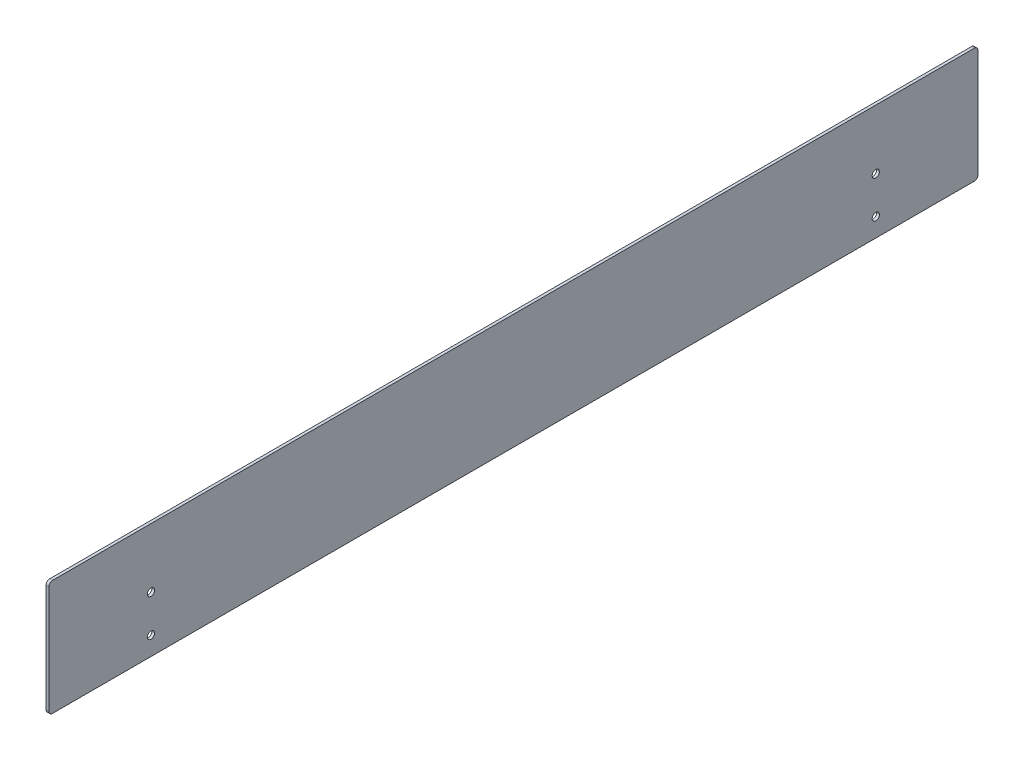
ISO-10303-21;
HEADER;
FILE_DESCRIPTION(('STEP AP214'),'2;1');
FILE_NAME('part.step','',(''),(''),'','','');
FILE_SCHEMA(('AUTOMOTIVE_DESIGN { 1 0 10303 214 1 1 1 1 }'));
ENDSEC;
DATA;
#1=APPLICATION_CONTEXT('core data for automotive mechanical design processes');
#2=APPLICATION_PROTOCOL_DEFINITION('international standard','automotive_design',2000,#1);
#3=PRODUCT_CONTEXT('',#1,'mechanical');
#4=PRODUCT('Part','Part','',(#3));
#5=PRODUCT_RELATED_PRODUCT_CATEGORY('part','',(#4));
#6=PRODUCT_DEFINITION_FORMATION('','',#4);
#7=PRODUCT_DEFINITION_CONTEXT('part definition',#1,'design');
#8=PRODUCT_DEFINITION('design','',#6,#7);
#9=PRODUCT_DEFINITION_SHAPE('','',#8);
#10=(LENGTH_UNIT() NAMED_UNIT(*) SI_UNIT(.MILLI.,.METRE.));
#11=(NAMED_UNIT(*) PLANE_ANGLE_UNIT() SI_UNIT($,.RADIAN.));
#12=(NAMED_UNIT(*) SI_UNIT($,.STERADIAN.) SOLID_ANGLE_UNIT());
#13=UNCERTAINTY_MEASURE_WITH_UNIT(LENGTH_MEASURE(1.E-05),#10,'distance_accuracy_value','');
#14=(GEOMETRIC_REPRESENTATION_CONTEXT(3) GLOBAL_UNCERTAINTY_ASSIGNED_CONTEXT((#13)) GLOBAL_UNIT_ASSIGNED_CONTEXT((#10,
#11,#12)) REPRESENTATION_CONTEXT('',''));
#15=CARTESIAN_POINT('',(0.,0.,0.));
#16=DIRECTION('',(0.,0.,1.));
#17=DIRECTION('',(1.,0.,0.));
#18=AXIS2_PLACEMENT_3D('',#15,#16,#17);
#19=CARTESIAN_POINT('',(1.5,0.,0.));
#20=DIRECTION('',(1.,0.,0.));
#21=DIRECTION('',(0.,0.,-1.));
#22=AXIS2_PLACEMENT_3D('',#19,#20,#21);
#23=PLANE('',#22);
#24=CARTESIAN_POINT('',(1.5,-110.292553191489,231.339345362168));
#25=DIRECTION('',(1.,0.,0.));
#26=DIRECTION('',(0.,0.,-1.));
#27=AXIS2_PLACEMENT_3D('',#24,#25,#26);
#28=CIRCLE('',#27,1.95);
#29=CARTESIAN_POINT('',(1.5,-110.292553191489,229.389345362168));
#30=VERTEX_POINT('',#29);
#31=EDGE_CURVE('E181',#30,#30,#28,.T.);
#32=ORIENTED_EDGE('',*,*,#31,.F.);
#33=EDGE_LOOP('',(#32));
#34=FACE_BOUND('',#33,.T.);
#35=CARTESIAN_POINT('',(1.5,-110.292553191489,-158.660654637832));
#36=DIRECTION('',(1.,0.,0.));
#37=DIRECTION('',(0.,0.,-1.));
#38=AXIS2_PLACEMENT_3D('',#35,#36,#37);
#39=CIRCLE('',#38,1.95);
#40=CARTESIAN_POINT('',(1.5,-110.292553191489,-160.610654637832));
#41=VERTEX_POINT('',#40);
#42=EDGE_CURVE('E164',#41,#41,#39,.T.);
#43=ORIENTED_EDGE('',*,*,#42,.F.);
#44=EDGE_LOOP('',(#43));
#45=FACE_BOUND('',#44,.T.);
#46=DIRECTION('',(0.,0.,-1.));
#47=VECTOR('',#46,1.);
#48=CARTESIAN_POINT('',(1.5,-140.292553191489,286.339345362168));
#49=LINE('',#48,#47);
#50=CARTESIAN_POINT('',(1.5,-140.292553191489,284.339345362168));
#51=VERTEX_POINT('',#50);
#52=CARTESIAN_POINT('',(1.5,-140.292553191489,-211.660654637832));
#53=VERTEX_POINT('',#52);
#54=EDGE_CURVE('E171',#51,#53,#49,.T.);
#55=ORIENTED_EDGE('',*,*,#54,.T.);
#56=CARTESIAN_POINT('',(1.5,-138.292553191489,-211.660654637832));
#57=DIRECTION('',(1.,0.,0.));
#58=DIRECTION('',(0.,0.,-1.));
#59=AXIS2_PLACEMENT_3D('',#56,#57,#58);
#60=CIRCLE('',#59,2.);
#61=CARTESIAN_POINT('',(1.5,-138.292553191489,-213.660654637832));
#62=VERTEX_POINT('',#61);
#63=EDGE_CURVE('E148',#53,#62,#60,.T.);
#64=ORIENTED_EDGE('',*,*,#63,.T.);
#65=DIRECTION('',(0.,1.,0.));
#66=VECTOR('',#65,1.);
#67=CARTESIAN_POINT('',(1.5,-78.2925531914894,-213.660654637832));
#68=LINE('',#67,#66);
#69=CARTESIAN_POINT('',(1.5,-80.2925531914894,-213.660654637832));
#70=VERTEX_POINT('',#69);
#71=EDGE_CURVE('E118',#62,#70,#68,.T.);
#72=ORIENTED_EDGE('',*,*,#71,.T.);
#73=CARTESIAN_POINT('',(1.5,-80.2925531914894,-211.660654637832));
#74=DIRECTION('',(1.,0.,0.));
#75=DIRECTION('',(0.,0.,-1.));
#76=AXIS2_PLACEMENT_3D('',#73,#74,#75);
#77=CIRCLE('',#76,2.);
#78=CARTESIAN_POINT('',(1.5,-78.2925531914894,-211.660654637832));
#79=VERTEX_POINT('',#78);
#80=EDGE_CURVE('E55',#70,#79,#77,.T.);
#81=ORIENTED_EDGE('',*,*,#80,.T.);
#82=DIRECTION('',(0.,0.,1.));
#83=VECTOR('',#82,1.);
#84=CARTESIAN_POINT('',(1.5,-78.2925531914894,286.339345362168));
#85=LINE('',#84,#83);
#86=CARTESIAN_POINT('',(1.5,-78.2925531914894,284.339345362168));
#87=VERTEX_POINT('',#86);
#88=EDGE_CURVE('E134',#79,#87,#85,.T.);
#89=ORIENTED_EDGE('',*,*,#88,.T.);
#90=CARTESIAN_POINT('',(1.5,-80.2925531914894,284.339345362168));
#91=DIRECTION('',(1.,0.,0.));
#92=DIRECTION('',(0.,0.,-1.));
#93=AXIS2_PLACEMENT_3D('',#90,#91,#92);
#94=CIRCLE('',#93,2.);
#95=CARTESIAN_POINT('',(1.5,-80.2925531914894,286.339345362168));
#96=VERTEX_POINT('',#95);
#97=EDGE_CURVE('E143',#87,#96,#94,.T.);
#98=ORIENTED_EDGE('',*,*,#97,.T.);
#99=DIRECTION('',(0.,-1.,0.));
#100=VECTOR('',#99,1.);
#101=CARTESIAN_POINT('',(1.5,-78.2925531914894,286.339345362168));
#102=LINE('',#101,#100);
#103=CARTESIAN_POINT('',(1.5,-138.292553191489,286.339345362168));
#104=VERTEX_POINT('',#103);
#105=EDGE_CURVE('E128',#96,#104,#102,.T.);
#106=ORIENTED_EDGE('',*,*,#105,.T.);
#107=CARTESIAN_POINT('',(1.5,-138.292553191489,284.339345362168));
#108=DIRECTION('',(1.,0.,0.));
#109=DIRECTION('',(0.,0.,-1.));
#110=AXIS2_PLACEMENT_3D('',#107,#108,#109);
#111=CIRCLE('',#110,2.);
#112=EDGE_CURVE('E145',#104,#51,#111,.T.);
#113=ORIENTED_EDGE('',*,*,#112,.T.);
#114=EDGE_LOOP('',(#55,#64,#72,#81,#89,#98,#106,#113));
#115=FACE_BOUND('',#114,.T.);
#116=CARTESIAN_POINT('',(1.5,-130.292553191489,-158.660654637832));
#117=DIRECTION('',(1.,0.,0.));
#118=DIRECTION('',(0.,0.,-1.));
#119=AXIS2_PLACEMENT_3D('',#116,#117,#118);
#120=CIRCLE('',#119,1.95);
#121=CARTESIAN_POINT('',(1.5,-130.292553191489,-160.610654637832));
#122=VERTEX_POINT('',#121);
#123=EDGE_CURVE('E176',#122,#122,#120,.T.);
#124=ORIENTED_EDGE('',*,*,#123,.F.);
#125=EDGE_LOOP('',(#124));
#126=FACE_BOUND('',#125,.T.);
#127=CARTESIAN_POINT('',(1.5,-130.292553191489,231.339345362168));
#128=DIRECTION('',(1.,0.,0.));
#129=DIRECTION('',(0.,0.,-1.));
#130=AXIS2_PLACEMENT_3D('',#127,#128,#129);
#131=CIRCLE('',#130,1.95);
#132=CARTESIAN_POINT('',(1.5,-130.292553191489,229.389345362168));
#133=VERTEX_POINT('',#132);
#134=EDGE_CURVE('E187',#133,#133,#131,.T.);
#135=ORIENTED_EDGE('',*,*,#134,.F.);
#136=EDGE_LOOP('',(#135));
#137=FACE_BOUND('',#136,.T.);
#138=ADVANCED_FACE('F33',(#34,#45,#115,#126,#137),#23,.T.);
#139=CARTESIAN_POINT('',(0.,0.,0.));
#140=DIRECTION('',(1.,0.,0.));
#141=DIRECTION('',(0.,0.,-1.));
#142=AXIS2_PLACEMENT_3D('',#139,#140,#141);
#143=PLANE('',#142);
#144=DIRECTION('',(0.,1.,0.));
#145=VECTOR('',#144,1.);
#146=CARTESIAN_POINT('',(0.,-78.2925531914894,-213.660654637832));
#147=LINE('',#146,#145);
#148=CARTESIAN_POINT('',(0.,-138.292553191489,-213.660654637832));
#149=VERTEX_POINT('',#148);
#150=CARTESIAN_POINT('',(0.,-80.2925531914894,-213.660654637832));
#151=VERTEX_POINT('',#150);
#152=EDGE_CURVE('E116',#149,#151,#147,.T.);
#153=ORIENTED_EDGE('',*,*,#152,.F.);
#154=CARTESIAN_POINT('',(0.,-138.292553191489,-211.660654637832));
#155=DIRECTION('',(1.,0.,0.));
#156=DIRECTION('',(0.,0.,-1.));
#157=AXIS2_PLACEMENT_3D('',#154,#155,#156);
#158=CIRCLE('',#157,2.);
#159=CARTESIAN_POINT('',(0.,-140.292553191489,-211.660654637832));
#160=VERTEX_POINT('',#159);
#161=EDGE_CURVE('E99',#149,#160,#158,.F.);
#162=ORIENTED_EDGE('',*,*,#161,.T.);
#163=DIRECTION('',(0.,0.,-1.));
#164=VECTOR('',#163,1.);
#165=CARTESIAN_POINT('',(0.,-140.292553191489,286.339345362168));
#166=LINE('',#165,#164);
#167=CARTESIAN_POINT('',(0.,-140.292553191489,284.339345362168));
#168=VERTEX_POINT('',#167);
#169=EDGE_CURVE('E126',#168,#160,#166,.T.);
#170=ORIENTED_EDGE('',*,*,#169,.F.);
#171=CARTESIAN_POINT('',(0.,-138.292553191489,284.339345362168));
#172=DIRECTION('',(1.,0.,0.));
#173=DIRECTION('',(0.,0.,-1.));
#174=AXIS2_PLACEMENT_3D('',#171,#172,#173);
#175=CIRCLE('',#174,2.);
#176=CARTESIAN_POINT('',(0.,-138.292553191489,286.339345362168));
#177=VERTEX_POINT('',#176);
#178=EDGE_CURVE('E137',#168,#177,#175,.F.);
#179=ORIENTED_EDGE('',*,*,#178,.T.);
#180=DIRECTION('',(0.,-1.,0.));
#181=VECTOR('',#180,1.);
#182=CARTESIAN_POINT('',(0.,-78.2925531914894,286.339345362168));
#183=LINE('',#182,#181);
#184=CARTESIAN_POINT('',(0.,-80.2925531914894,286.339345362168));
#185=VERTEX_POINT('',#184);
#186=EDGE_CURVE('E130',#185,#177,#183,.T.);
#187=ORIENTED_EDGE('',*,*,#186,.F.);
#188=CARTESIAN_POINT('',(0.,-80.2925531914894,284.339345362168));
#189=DIRECTION('',(1.,0.,0.));
#190=DIRECTION('',(0.,0.,-1.));
#191=AXIS2_PLACEMENT_3D('',#188,#189,#190);
#192=CIRCLE('',#191,2.);
#193=CARTESIAN_POINT('',(0.,-78.2925531914894,284.339345362168));
#194=VERTEX_POINT('',#193);
#195=EDGE_CURVE('E119',#185,#194,#192,.F.);
#196=ORIENTED_EDGE('',*,*,#195,.T.);
#197=DIRECTION('',(0.,0.,1.));
#198=VECTOR('',#197,1.);
#199=CARTESIAN_POINT('',(0.,-78.2925531914894,286.339345362168));
#200=LINE('',#199,#198);
#201=CARTESIAN_POINT('',(0.,-78.2925531914894,-211.660654637832));
#202=VERTEX_POINT('',#201);
#203=EDGE_CURVE('E125',#202,#194,#200,.T.);
#204=ORIENTED_EDGE('',*,*,#203,.F.);
#205=CARTESIAN_POINT('',(0.,-80.2925531914894,-211.660654637832));
#206=DIRECTION('',(1.,0.,0.));
#207=DIRECTION('',(0.,0.,-1.));
#208=AXIS2_PLACEMENT_3D('',#205,#206,#207);
#209=CIRCLE('',#208,2.);
#210=EDGE_CURVE('E110',#202,#151,#209,.F.);
#211=ORIENTED_EDGE('',*,*,#210,.T.);
#212=EDGE_LOOP('',(#153,#162,#170,#179,#187,#196,#204,#211));
#213=FACE_BOUND('',#212,.T.);
#214=CARTESIAN_POINT('',(0.,-110.292553191489,-158.660654637832));
#215=DIRECTION('',(1.,0.,0.));
#216=DIRECTION('',(0.,0.,-1.));
#217=AXIS2_PLACEMENT_3D('',#214,#215,#216);
#218=CIRCLE('',#217,1.95);
#219=CARTESIAN_POINT('',(0.,-110.292553191489,-160.610654637832));
#220=VERTEX_POINT('',#219);
#221=EDGE_CURVE('E166',#220,#220,#218,.T.);
#222=ORIENTED_EDGE('',*,*,#221,.T.);
#223=EDGE_LOOP('',(#222));
#224=FACE_BOUND('',#223,.T.);
#225=CARTESIAN_POINT('',(0.,-130.292553191489,-158.660654637832));
#226=DIRECTION('',(1.,0.,0.));
#227=DIRECTION('',(0.,0.,-1.));
#228=AXIS2_PLACEMENT_3D('',#225,#226,#227);
#229=CIRCLE('',#228,1.95);
#230=CARTESIAN_POINT('',(0.,-130.292553191489,-160.610654637832));
#231=VERTEX_POINT('',#230);
#232=EDGE_CURVE('E178',#231,#231,#229,.T.);
#233=ORIENTED_EDGE('',*,*,#232,.T.);
#234=EDGE_LOOP('',(#233));
#235=FACE_BOUND('',#234,.T.);
#236=CARTESIAN_POINT('',(0.,-110.292553191489,231.339345362168));
#237=DIRECTION('',(1.,0.,0.));
#238=DIRECTION('',(0.,0.,-1.));
#239=AXIS2_PLACEMENT_3D('',#236,#237,#238);
#240=CIRCLE('',#239,1.95);
#241=CARTESIAN_POINT('',(0.,-110.292553191489,229.389345362168));
#242=VERTEX_POINT('',#241);
#243=EDGE_CURVE('E184',#242,#242,#240,.T.);
#244=ORIENTED_EDGE('',*,*,#243,.T.);
#245=EDGE_LOOP('',(#244));
#246=FACE_BOUND('',#245,.T.);
#247=CARTESIAN_POINT('',(0.,-130.292553191489,231.339345362168));
#248=DIRECTION('',(1.,0.,0.));
#249=DIRECTION('',(0.,0.,-1.));
#250=AXIS2_PLACEMENT_3D('',#247,#248,#249);
#251=CIRCLE('',#250,1.95);
#252=CARTESIAN_POINT('',(0.,-130.292553191489,229.389345362168));
#253=VERTEX_POINT('',#252);
#254=EDGE_CURVE('E190',#253,#253,#251,.T.);
#255=ORIENTED_EDGE('',*,*,#254,.T.);
#256=EDGE_LOOP('',(#255));
#257=FACE_BOUND('',#256,.T.);
#258=ADVANCED_FACE('F122',(#213,#224,#235,#246,#257),#143,.F.);
#259=CARTESIAN_POINT('',(1.5,-78.2925531914894,286.339345362168));
#260=DIRECTION('',(0.,0.,-1.));
#261=DIRECTION('',(-1.,0.,0.));
#262=AXIS2_PLACEMENT_3D('',#259,#260,#261);
#263=PLANE('',#262);
#264=ORIENTED_EDGE('',*,*,#186,.T.);
#265=DIRECTION('',(-1.,0.,0.));
#266=VECTOR('',#265,1.);
#267=CARTESIAN_POINT('',(1.5,-138.292553191489,286.339345362168));
#268=LINE('',#267,#266);
#269=EDGE_CURVE('E11',#177,#104,#268,.F.);
#270=ORIENTED_EDGE('',*,*,#269,.T.);
#271=ORIENTED_EDGE('',*,*,#105,.F.);
#272=DIRECTION('',(-1.,0.,0.));
#273=VECTOR('',#272,1.);
#274=CARTESIAN_POINT('',(1.5,-80.2925531914894,286.339345362168));
#275=LINE('',#274,#273);
#276=EDGE_CURVE('E41',#96,#185,#275,.T.);
#277=ORIENTED_EDGE('',*,*,#276,.T.);
#278=EDGE_LOOP('',(#264,#270,#271,#277));
#279=FACE_BOUND('',#278,.T.);
#280=ADVANCED_FACE('F159',(#279),#263,.F.);
#281=CARTESIAN_POINT('',(1.5,-140.292553191489,286.339345362168));
#282=DIRECTION('',(0.,1.,0.));
#283=DIRECTION('',(0.,0.,1.));
#284=AXIS2_PLACEMENT_3D('',#281,#282,#283);
#285=PLANE('',#284);
#286=ORIENTED_EDGE('',*,*,#169,.T.);
#287=DIRECTION('',(-1.,0.,0.));
#288=VECTOR('',#287,1.);
#289=CARTESIAN_POINT('',(1.5,-140.292553191489,-211.660654637832));
#290=LINE('',#289,#288);
#291=EDGE_CURVE('E104',#160,#53,#290,.F.);
#292=ORIENTED_EDGE('',*,*,#291,.T.);
#293=ORIENTED_EDGE('',*,*,#54,.F.);
#294=DIRECTION('',(-1.,0.,0.));
#295=VECTOR('',#294,1.);
#296=CARTESIAN_POINT('',(1.5,-140.292553191489,284.339345362168));
#297=LINE('',#296,#295);
#298=EDGE_CURVE('E109',#51,#168,#297,.T.);
#299=ORIENTED_EDGE('',*,*,#298,.T.);
#300=EDGE_LOOP('',(#286,#292,#293,#299));
#301=FACE_BOUND('',#300,.T.);
#302=ADVANCED_FACE('F217',(#301),#285,.F.);
#303=CARTESIAN_POINT('',(1.5,-78.2925531914894,-213.660654637832));
#304=DIRECTION('',(0.,0.,1.));
#305=DIRECTION('',(0.,-1.,0.));
#306=AXIS2_PLACEMENT_3D('',#303,#304,#305);
#307=PLANE('',#306);
#308=ORIENTED_EDGE('',*,*,#71,.F.);
#309=DIRECTION('',(-1.,0.,0.));
#310=VECTOR('',#309,1.);
#311=CARTESIAN_POINT('',(1.5,-138.292553191489,-213.660654637832));
#312=LINE('',#311,#310);
#313=EDGE_CURVE('E103',#62,#149,#312,.T.);
#314=ORIENTED_EDGE('',*,*,#313,.T.);
#315=ORIENTED_EDGE('',*,*,#152,.T.);
#316=DIRECTION('',(-1.,0.,0.));
#317=VECTOR('',#316,1.);
#318=CARTESIAN_POINT('',(1.5,-80.2925531914894,-213.660654637832));
#319=LINE('',#318,#317);
#320=EDGE_CURVE('E120',#151,#70,#319,.F.);
#321=ORIENTED_EDGE('',*,*,#320,.T.);
#322=EDGE_LOOP('',(#308,#314,#315,#321));
#323=FACE_BOUND('',#322,.T.);
#324=ADVANCED_FACE('F115',(#323),#307,.F.);
#325=CARTESIAN_POINT('',(1.5,-78.2925531914894,286.339345362168));
#326=DIRECTION('',(0.,-1.,0.));
#327=DIRECTION('',(0.,0.,-1.));
#328=AXIS2_PLACEMENT_3D('',#325,#326,#327);
#329=PLANE('',#328);
#330=ORIENTED_EDGE('',*,*,#88,.F.);
#331=DIRECTION('',(-1.,0.,0.));
#332=VECTOR('',#331,1.);
#333=CARTESIAN_POINT('',(1.5,-78.2925531914894,-211.660654637832));
#334=LINE('',#333,#332);
#335=EDGE_CURVE('E151',#79,#202,#334,.T.);
#336=ORIENTED_EDGE('',*,*,#335,.T.);
#337=ORIENTED_EDGE('',*,*,#203,.T.);
#338=DIRECTION('',(-1.,0.,0.));
#339=VECTOR('',#338,1.);
#340=CARTESIAN_POINT('',(1.5,-78.2925531914894,284.339345362168));
#341=LINE('',#340,#339);
#342=EDGE_CURVE('E48',#194,#87,#341,.F.);
#343=ORIENTED_EDGE('',*,*,#342,.T.);
#344=EDGE_LOOP('',(#330,#336,#337,#343));
#345=FACE_BOUND('',#344,.T.);
#346=ADVANCED_FACE('F212',(#345),#329,.F.);
#347=CARTESIAN_POINT('',(1.5,-110.292553191489,-158.660654637832));
#348=DIRECTION('',(-1.,0.,0.));
#349=DIRECTION('',(0.,0.,1.));
#350=AXIS2_PLACEMENT_3D('',#347,#348,#349);
#351=CYLINDRICAL_SURFACE('',#350,1.95);
#352=ORIENTED_EDGE('',*,*,#42,.T.);
#353=EDGE_LOOP('',(#352));
#354=FACE_BOUND('',#353,.T.);
#355=ORIENTED_EDGE('',*,*,#221,.F.);
#356=EDGE_LOOP('',(#355));
#357=FACE_BOUND('',#356,.T.);
#358=ADVANCED_FACE('F209',(#354,#357),#351,.F.);
#359=CARTESIAN_POINT('',(1.5,-130.292553191489,-158.660654637832));
#360=DIRECTION('',(-1.,0.,0.));
#361=DIRECTION('',(0.,0.,1.));
#362=AXIS2_PLACEMENT_3D('',#359,#360,#361);
#363=CYLINDRICAL_SURFACE('',#362,1.95);
#364=ORIENTED_EDGE('',*,*,#123,.T.);
#365=EDGE_LOOP('',(#364));
#366=FACE_BOUND('',#365,.T.);
#367=ORIENTED_EDGE('',*,*,#232,.F.);
#368=EDGE_LOOP('',(#367));
#369=FACE_BOUND('',#368,.T.);
#370=ADVANCED_FACE('F241',(#366,#369),#363,.F.);
#371=CARTESIAN_POINT('',(1.5,-110.292553191489,231.339345362168));
#372=DIRECTION('',(-1.,0.,0.));
#373=DIRECTION('',(0.,0.,1.));
#374=AXIS2_PLACEMENT_3D('',#371,#372,#373);
#375=CYLINDRICAL_SURFACE('',#374,1.95);
#376=ORIENTED_EDGE('',*,*,#31,.T.);
#377=EDGE_LOOP('',(#376));
#378=FACE_BOUND('',#377,.T.);
#379=ORIENTED_EDGE('',*,*,#243,.F.);
#380=EDGE_LOOP('',(#379));
#381=FACE_BOUND('',#380,.T.);
#382=ADVANCED_FACE('F244',(#378,#381),#375,.F.);
#383=CARTESIAN_POINT('',(1.5,-130.292553191489,231.339345362168));
#384=DIRECTION('',(-1.,0.,0.));
#385=DIRECTION('',(0.,0.,1.));
#386=AXIS2_PLACEMENT_3D('',#383,#384,#385);
#387=CYLINDRICAL_SURFACE('',#386,1.95);
#388=ORIENTED_EDGE('',*,*,#134,.T.);
#389=EDGE_LOOP('',(#388));
#390=FACE_BOUND('',#389,.T.);
#391=ORIENTED_EDGE('',*,*,#254,.F.);
#392=EDGE_LOOP('',(#391));
#393=FACE_BOUND('',#392,.T.);
#394=ADVANCED_FACE('F196',(#390,#393),#387,.F.);
#395=CARTESIAN_POINT('',(1.5,-138.292553191489,-211.660654637832));
#396=DIRECTION('',(-1.,0.,0.));
#397=DIRECTION('',(0.,0.,1.));
#398=AXIS2_PLACEMENT_3D('',#395,#396,#397);
#399=CYLINDRICAL_SURFACE('',#398,2.);
#400=ORIENTED_EDGE('',*,*,#63,.F.);
#401=ORIENTED_EDGE('',*,*,#291,.F.);
#402=ORIENTED_EDGE('',*,*,#161,.F.);
#403=ORIENTED_EDGE('',*,*,#313,.F.);
#404=EDGE_LOOP('',(#400,#401,#402,#403));
#405=FACE_BOUND('',#404,.T.);
#406=ADVANCED_FACE('F102',(#405),#399,.T.);
#407=CARTESIAN_POINT('',(1.5,-80.2925531914894,-211.660654637832));
#408=DIRECTION('',(-1.,0.,0.));
#409=DIRECTION('',(0.,0.,1.));
#410=AXIS2_PLACEMENT_3D('',#407,#408,#409);
#411=CYLINDRICAL_SURFACE('',#410,2.);
#412=ORIENTED_EDGE('',*,*,#80,.F.);
#413=ORIENTED_EDGE('',*,*,#320,.F.);
#414=ORIENTED_EDGE('',*,*,#210,.F.);
#415=ORIENTED_EDGE('',*,*,#335,.F.);
#416=EDGE_LOOP('',(#412,#413,#414,#415));
#417=FACE_BOUND('',#416,.T.);
#418=ADVANCED_FACE('F225',(#417),#411,.T.);
#419=CARTESIAN_POINT('',(1.5,-138.292553191489,284.339345362168));
#420=DIRECTION('',(-1.,0.,0.));
#421=DIRECTION('',(0.,0.,1.));
#422=AXIS2_PLACEMENT_3D('',#419,#420,#421);
#423=CYLINDRICAL_SURFACE('',#422,2.);
#424=ORIENTED_EDGE('',*,*,#112,.F.);
#425=ORIENTED_EDGE('',*,*,#269,.F.);
#426=ORIENTED_EDGE('',*,*,#178,.F.);
#427=ORIENTED_EDGE('',*,*,#298,.F.);
#428=EDGE_LOOP('',(#424,#425,#426,#427));
#429=FACE_BOUND('',#428,.T.);
#430=ADVANCED_FACE('F227',(#429),#423,.T.);
#431=CARTESIAN_POINT('',(1.5,-80.2925531914894,284.339345362168));
#432=DIRECTION('',(-1.,0.,0.));
#433=DIRECTION('',(0.,0.,1.));
#434=AXIS2_PLACEMENT_3D('',#431,#432,#433);
#435=CYLINDRICAL_SURFACE('',#434,2.);
#436=ORIENTED_EDGE('',*,*,#97,.F.);
#437=ORIENTED_EDGE('',*,*,#342,.F.);
#438=ORIENTED_EDGE('',*,*,#195,.F.);
#439=ORIENTED_EDGE('',*,*,#276,.F.);
#440=EDGE_LOOP('',(#436,#437,#438,#439));
#441=FACE_BOUND('',#440,.T.);
#442=ADVANCED_FACE('F35',(#441),#435,.T.);
#443=CLOSED_SHELL('',(#138,#258,#280,#302,#324,#346,#358,#370,#382,#394,#406,#418,#430,#442));
#444=MANIFOLD_SOLID_BREP('B2',#443);
#445=ADVANCED_BREP_SHAPE_REPRESENTATION('',(#18,#444),#14);
#446=SHAPE_DEFINITION_REPRESENTATION(#9,#445);
ENDSEC;
END-ISO-10303-21;
